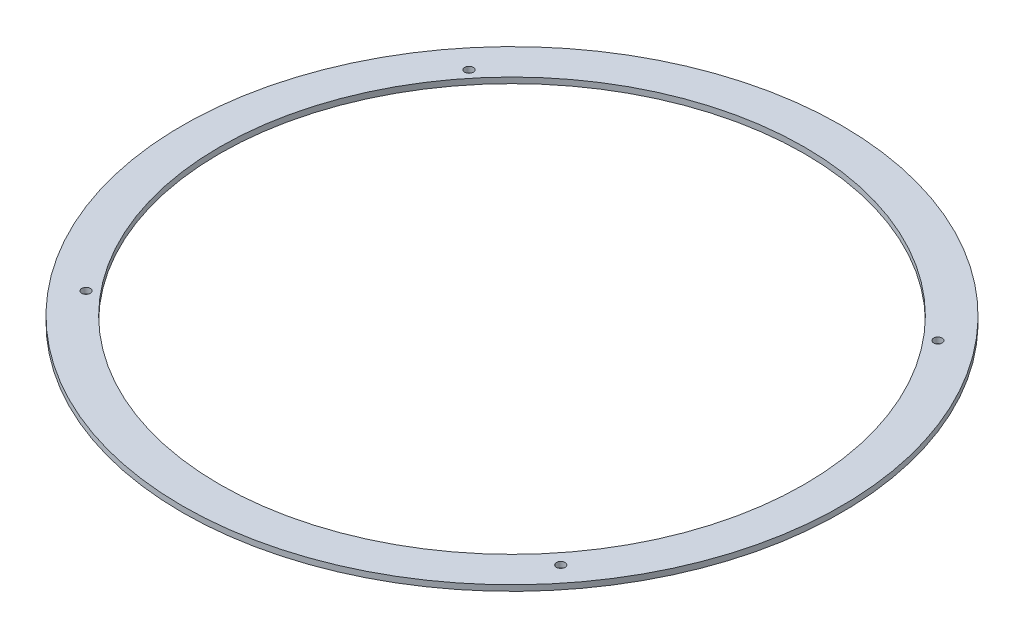
ISO-10303-21;
HEADER;
FILE_DESCRIPTION(('STEP AP214'),'2;1');
FILE_NAME('part.step','',(''),(''),'','','');
FILE_SCHEMA(('AUTOMOTIVE_DESIGN { 1 0 10303 214 1 1 1 1 }'));
ENDSEC;
DATA;
#1=APPLICATION_CONTEXT('core data for automotive mechanical design processes');
#2=APPLICATION_PROTOCOL_DEFINITION('international standard','automotive_design',2000,#1);
#3=PRODUCT_CONTEXT('',#1,'mechanical');
#4=PRODUCT('Part','Part','',(#3));
#5=PRODUCT_RELATED_PRODUCT_CATEGORY('part','',(#4));
#6=PRODUCT_DEFINITION_FORMATION('','',#4);
#7=PRODUCT_DEFINITION_CONTEXT('part definition',#1,'design');
#8=PRODUCT_DEFINITION('design','',#6,#7);
#9=PRODUCT_DEFINITION_SHAPE('','',#8);
#10=(LENGTH_UNIT() NAMED_UNIT(*) SI_UNIT(.MILLI.,.METRE.));
#11=(NAMED_UNIT(*) PLANE_ANGLE_UNIT() SI_UNIT($,.RADIAN.));
#12=(NAMED_UNIT(*) SI_UNIT($,.STERADIAN.) SOLID_ANGLE_UNIT());
#13=UNCERTAINTY_MEASURE_WITH_UNIT(LENGTH_MEASURE(1.E-05),#10,'distance_accuracy_value','');
#14=(GEOMETRIC_REPRESENTATION_CONTEXT(3) GLOBAL_UNCERTAINTY_ASSIGNED_CONTEXT((#13)) GLOBAL_UNIT_ASSIGNED_CONTEXT((#10,
#11,#12)) REPRESENTATION_CONTEXT('',''));
#15=CARTESIAN_POINT('',(0.,0.,0.));
#16=DIRECTION('',(0.,0.,1.));
#17=DIRECTION('',(1.,0.,0.));
#18=AXIS2_PLACEMENT_3D('',#15,#16,#17);
#19=CARTESIAN_POINT('',(0.,2.,0.));
#20=DIRECTION('',(0.,1.,0.));
#21=DIRECTION('',(0.,0.,1.));
#22=AXIS2_PLACEMENT_3D('',#19,#20,#21);
#23=PLANE('',#22);
#24=CARTESIAN_POINT('',(83.8198051533948,2.,66.8198051533947));
#25=DIRECTION('',(0.,1.,0.));
#26=DIRECTION('',(0.,0.,1.));
#27=AXIS2_PLACEMENT_3D('',#24,#25,#26);
#28=CIRCLE('',#27,1.50000000000002);
#29=CARTESIAN_POINT('',(83.8198051533948,2.,68.3198051533947));
#30=VERTEX_POINT('',#29);
#31=EDGE_CURVE('E76',#30,#30,#28,.T.);
#32=ORIENTED_EDGE('',*,*,#31,.F.);
#33=EDGE_LOOP('',(#32));
#34=FACE_BOUND('',#33,.T.);
#35=CARTESIAN_POINT('',(-81.8198051533948,2.,-66.8198051533947));
#36=DIRECTION('',(0.,1.,0.));
#37=DIRECTION('',(0.,0.,1.));
#38=AXIS2_PLACEMENT_3D('',#35,#36,#37);
#39=CIRCLE('',#38,1.50000000000001);
#40=CARTESIAN_POINT('',(-81.8198051533948,2.,-65.3198051533947));
#41=VERTEX_POINT('',#40);
#42=EDGE_CURVE('E60',#41,#41,#39,.T.);
#43=ORIENTED_EDGE('',*,*,#42,.F.);
#44=EDGE_LOOP('',(#43));
#45=FACE_BOUND('',#44,.T.);
#46=CARTESIAN_POINT('',(0.,2.,0.));
#47=DIRECTION('',(0.,1.,0.));
#48=DIRECTION('',(0.,0.,1.));
#49=AXIS2_PLACEMENT_3D('',#46,#47,#48);
#50=CIRCLE('',#49,115.);
#51=CARTESIAN_POINT('',(0.,2.,115.));
#52=VERTEX_POINT('',#51);
#53=EDGE_CURVE('E10',#52,#52,#50,.T.);
#54=ORIENTED_EDGE('',*,*,#53,.T.);
#55=EDGE_LOOP('',(#54));
#56=FACE_BOUND('',#55,.T.);
#57=CARTESIAN_POINT('',(0.,2.,0.));
#58=DIRECTION('',(0.,1.,0.));
#59=DIRECTION('',(0.,0.,1.));
#60=AXIS2_PLACEMENT_3D('',#57,#58,#59);
#61=CIRCLE('',#60,102.);
#62=CARTESIAN_POINT('',(0.,2.,102.));
#63=VERTEX_POINT('',#62);
#64=EDGE_CURVE('E54',#63,#63,#61,.T.);
#65=ORIENTED_EDGE('',*,*,#64,.F.);
#66=EDGE_LOOP('',(#65));
#67=FACE_BOUND('',#66,.T.);
#68=CARTESIAN_POINT('',(-81.8198051533947,2.,66.8198051533948));
#69=DIRECTION('',(0.,1.,0.));
#70=DIRECTION('',(0.,0.,1.));
#71=AXIS2_PLACEMENT_3D('',#68,#69,#70);
#72=CIRCLE('',#71,1.50000000000003);
#73=CARTESIAN_POINT('',(-81.8198051533947,2.,68.3198051533948));
#74=VERTEX_POINT('',#73);
#75=EDGE_CURVE('E68',#74,#74,#72,.T.);
#76=ORIENTED_EDGE('',*,*,#75,.F.);
#77=EDGE_LOOP('',(#76));
#78=FACE_BOUND('',#77,.T.);
#79=CARTESIAN_POINT('',(81.8198051533947,2.,-66.8198051533948));
#80=DIRECTION('',(0.,1.,0.));
#81=DIRECTION('',(0.,0.,1.));
#82=AXIS2_PLACEMENT_3D('',#79,#80,#81);
#83=CIRCLE('',#82,1.5);
#84=CARTESIAN_POINT('',(81.8198051533947,2.,-65.3198051533948));
#85=VERTEX_POINT('',#84);
#86=EDGE_CURVE('E84',#85,#85,#83,.T.);
#87=ORIENTED_EDGE('',*,*,#86,.F.);
#88=EDGE_LOOP('',(#87));
#89=FACE_BOUND('',#88,.T.);
#90=ADVANCED_FACE('F41',(#34,#45,#56,#67,#78,#89),#23,.T.);
#91=CARTESIAN_POINT('',(0.,0.,0.));
#92=DIRECTION('',(0.,1.,0.));
#93=DIRECTION('',(0.,0.,1.));
#94=AXIS2_PLACEMENT_3D('',#91,#92,#93);
#95=PLANE('',#94);
#96=CARTESIAN_POINT('',(0.,0.,0.));
#97=DIRECTION('',(0.,1.,0.));
#98=DIRECTION('',(0.,0.,1.));
#99=AXIS2_PLACEMENT_3D('',#96,#97,#98);
#100=CIRCLE('',#99,115.);
#101=CARTESIAN_POINT('',(0.,0.,115.));
#102=VERTEX_POINT('',#101);
#103=EDGE_CURVE('E45',#102,#102,#100,.T.);
#104=ORIENTED_EDGE('',*,*,#103,.F.);
#105=EDGE_LOOP('',(#104));
#106=FACE_BOUND('',#105,.T.);
#107=CARTESIAN_POINT('',(0.,0.,0.));
#108=DIRECTION('',(0.,1.,0.));
#109=DIRECTION('',(0.,0.,1.));
#110=AXIS2_PLACEMENT_3D('',#107,#108,#109);
#111=CIRCLE('',#110,102.);
#112=CARTESIAN_POINT('',(0.,0.,102.));
#113=VERTEX_POINT('',#112);
#114=EDGE_CURVE('E56',#113,#113,#111,.T.);
#115=ORIENTED_EDGE('',*,*,#114,.T.);
#116=EDGE_LOOP('',(#115));
#117=FACE_BOUND('',#116,.T.);
#118=CARTESIAN_POINT('',(-81.8198051533948,0.,-66.8198051533947));
#119=DIRECTION('',(0.,1.,0.));
#120=DIRECTION('',(0.,0.,1.));
#121=AXIS2_PLACEMENT_3D('',#118,#119,#120);
#122=CIRCLE('',#121,1.50000000000001);
#123=CARTESIAN_POINT('',(-81.8198051533948,0.,-65.3198051533947));
#124=VERTEX_POINT('',#123);
#125=EDGE_CURVE('E64',#124,#124,#122,.T.);
#126=ORIENTED_EDGE('',*,*,#125,.T.);
#127=EDGE_LOOP('',(#126));
#128=FACE_BOUND('',#127,.T.);
#129=CARTESIAN_POINT('',(-81.8198051533947,0.,66.8198051533948));
#130=DIRECTION('',(0.,1.,0.));
#131=DIRECTION('',(0.,0.,1.));
#132=AXIS2_PLACEMENT_3D('',#129,#130,#131);
#133=CIRCLE('',#132,1.50000000000003);
#134=CARTESIAN_POINT('',(-81.8198051533947,0.,68.3198051533948));
#135=VERTEX_POINT('',#134);
#136=EDGE_CURVE('E72',#135,#135,#133,.T.);
#137=ORIENTED_EDGE('',*,*,#136,.T.);
#138=EDGE_LOOP('',(#137));
#139=FACE_BOUND('',#138,.T.);
#140=CARTESIAN_POINT('',(83.8198051533948,0.,66.8198051533947));
#141=DIRECTION('',(0.,1.,0.));
#142=DIRECTION('',(0.,0.,1.));
#143=AXIS2_PLACEMENT_3D('',#140,#141,#142);
#144=CIRCLE('',#143,1.50000000000002);
#145=CARTESIAN_POINT('',(83.8198051533948,0.,68.3198051533947));
#146=VERTEX_POINT('',#145);
#147=EDGE_CURVE('E80',#146,#146,#144,.T.);
#148=ORIENTED_EDGE('',*,*,#147,.T.);
#149=EDGE_LOOP('',(#148));
#150=FACE_BOUND('',#149,.T.);
#151=CARTESIAN_POINT('',(81.8198051533947,0.,-66.8198051533948));
#152=DIRECTION('',(0.,1.,0.));
#153=DIRECTION('',(0.,0.,1.));
#154=AXIS2_PLACEMENT_3D('',#151,#152,#153);
#155=CIRCLE('',#154,1.5);
#156=CARTESIAN_POINT('',(81.8198051533947,0.,-65.3198051533948));
#157=VERTEX_POINT('',#156);
#158=EDGE_CURVE('E88',#157,#157,#155,.T.);
#159=ORIENTED_EDGE('',*,*,#158,.T.);
#160=EDGE_LOOP('',(#159));
#161=FACE_BOUND('',#160,.T.);
#162=ADVANCED_FACE('F100',(#106,#117,#128,#139,#150,#161),#95,.F.);
#163=CARTESIAN_POINT('',(0.,2.,0.));
#164=DIRECTION('',(0.,-1.,0.));
#165=DIRECTION('',(0.,0.,-1.));
#166=AXIS2_PLACEMENT_3D('',#163,#164,#165);
#167=CYLINDRICAL_SURFACE('',#166,115.);
#168=ORIENTED_EDGE('',*,*,#53,.F.);
#169=EDGE_LOOP('',(#168));
#170=FACE_BOUND('',#169,.T.);
#171=ORIENTED_EDGE('',*,*,#103,.T.);
#172=EDGE_LOOP('',(#171));
#173=FACE_BOUND('',#172,.T.);
#174=ADVANCED_FACE('F43',(#170,#173),#167,.T.);
#175=CARTESIAN_POINT('',(0.,2.,0.));
#176=DIRECTION('',(0.,-1.,0.));
#177=DIRECTION('',(0.,0.,-1.));
#178=AXIS2_PLACEMENT_3D('',#175,#176,#177);
#179=CYLINDRICAL_SURFACE('',#178,102.);
#180=ORIENTED_EDGE('',*,*,#64,.T.);
#181=EDGE_LOOP('',(#180));
#182=FACE_BOUND('',#181,.T.);
#183=ORIENTED_EDGE('',*,*,#114,.F.);
#184=EDGE_LOOP('',(#183));
#185=FACE_BOUND('',#184,.T.);
#186=ADVANCED_FACE('F110',(#182,#185),#179,.F.);
#187=CARTESIAN_POINT('',(-81.8198051533948,2.,-66.8198051533947));
#188=DIRECTION('',(0.,-1.,0.));
#189=DIRECTION('',(0.,0.,-1.));
#190=AXIS2_PLACEMENT_3D('',#187,#188,#189);
#191=CYLINDRICAL_SURFACE('',#190,1.50000000000001);
#192=ORIENTED_EDGE('',*,*,#42,.T.);
#193=EDGE_LOOP('',(#192));
#194=FACE_BOUND('',#193,.T.);
#195=ORIENTED_EDGE('',*,*,#125,.F.);
#196=EDGE_LOOP('',(#195));
#197=FACE_BOUND('',#196,.T.);
#198=ADVANCED_FACE('F113',(#194,#197),#191,.F.);
#199=CARTESIAN_POINT('',(-81.8198051533947,2.,66.8198051533948));
#200=DIRECTION('',(0.,-1.,0.));
#201=DIRECTION('',(0.,0.,-1.));
#202=AXIS2_PLACEMENT_3D('',#199,#200,#201);
#203=CYLINDRICAL_SURFACE('',#202,1.50000000000003);
#204=ORIENTED_EDGE('',*,*,#75,.T.);
#205=EDGE_LOOP('',(#204));
#206=FACE_BOUND('',#205,.T.);
#207=ORIENTED_EDGE('',*,*,#136,.F.);
#208=EDGE_LOOP('',(#207));
#209=FACE_BOUND('',#208,.T.);
#210=ADVANCED_FACE('F117',(#206,#209),#203,.F.);
#211=CARTESIAN_POINT('',(83.8198051533948,2.,66.8198051533947));
#212=DIRECTION('',(0.,-1.,0.));
#213=DIRECTION('',(0.,0.,-1.));
#214=AXIS2_PLACEMENT_3D('',#211,#212,#213);
#215=CYLINDRICAL_SURFACE('',#214,1.50000000000002);
#216=ORIENTED_EDGE('',*,*,#31,.T.);
#217=EDGE_LOOP('',(#216));
#218=FACE_BOUND('',#217,.T.);
#219=ORIENTED_EDGE('',*,*,#147,.F.);
#220=EDGE_LOOP('',(#219));
#221=FACE_BOUND('',#220,.T.);
#222=ADVANCED_FACE('F121',(#218,#221),#215,.F.);
#223=CARTESIAN_POINT('',(81.8198051533947,2.,-66.8198051533948));
#224=DIRECTION('',(0.,-1.,0.));
#225=DIRECTION('',(0.,0.,-1.));
#226=AXIS2_PLACEMENT_3D('',#223,#224,#225);
#227=CYLINDRICAL_SURFACE('',#226,1.5);
#228=ORIENTED_EDGE('',*,*,#86,.T.);
#229=EDGE_LOOP('',(#228));
#230=FACE_BOUND('',#229,.T.);
#231=ORIENTED_EDGE('',*,*,#158,.F.);
#232=EDGE_LOOP('',(#231));
#233=FACE_BOUND('',#232,.T.);
#234=ADVANCED_FACE('F96',(#230,#233),#227,.F.);
#235=CLOSED_SHELL('',(#90,#162,#174,#186,#198,#210,#222,#234));
#236=MANIFOLD_SOLID_BREP('B2',#235);
#237=ADVANCED_BREP_SHAPE_REPRESENTATION('',(#18,#236),#14);
#238=SHAPE_DEFINITION_REPRESENTATION(#9,#237);
ENDSEC;
END-ISO-10303-21;
